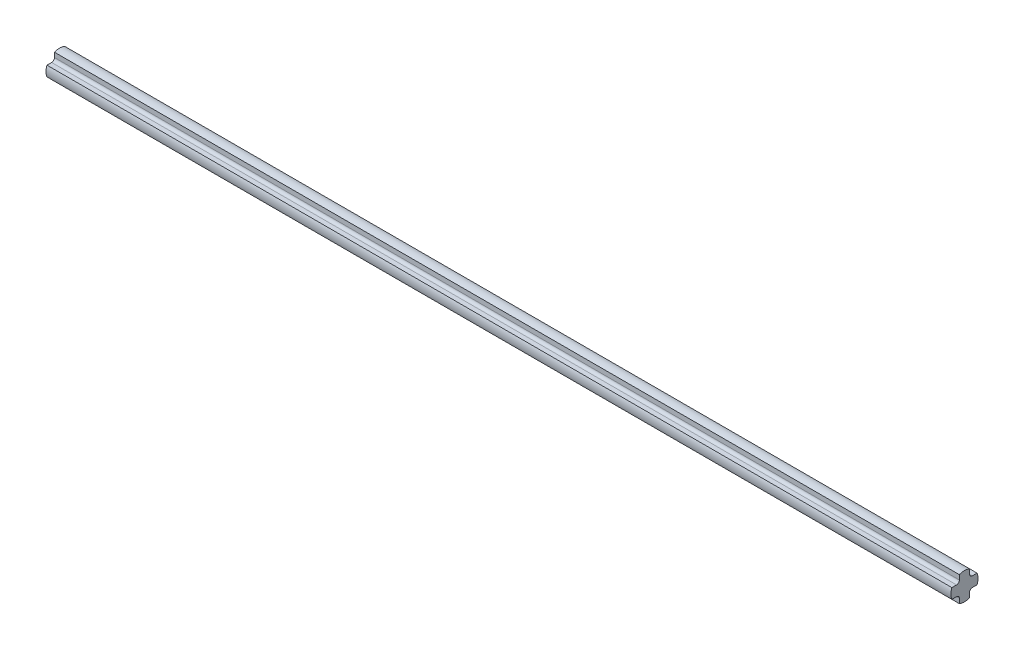
ISO-10303-21;
HEADER;
FILE_DESCRIPTION(('STEP AP214'),'2;1');
FILE_NAME('part.step','',(''),(''),'','','');
FILE_SCHEMA(('AUTOMOTIVE_DESIGN { 1 0 10303 214 1 1 1 1 }'));
ENDSEC;
DATA;
#1=APPLICATION_CONTEXT('core data for automotive mechanical design processes');
#2=APPLICATION_PROTOCOL_DEFINITION('international standard','automotive_design',2000,#1);
#3=PRODUCT_CONTEXT('',#1,'mechanical');
#4=PRODUCT('Part','Part','',(#3));
#5=PRODUCT_RELATED_PRODUCT_CATEGORY('part','',(#4));
#6=PRODUCT_DEFINITION_FORMATION('','',#4);
#7=PRODUCT_DEFINITION_CONTEXT('part definition',#1,'design');
#8=PRODUCT_DEFINITION('design','',#6,#7);
#9=PRODUCT_DEFINITION_SHAPE('','',#8);
#10=(LENGTH_UNIT() NAMED_UNIT(*) SI_UNIT(.MILLI.,.METRE.));
#11=(NAMED_UNIT(*) PLANE_ANGLE_UNIT() SI_UNIT($,.RADIAN.));
#12=(NAMED_UNIT(*) SI_UNIT($,.STERADIAN.) SOLID_ANGLE_UNIT());
#13=UNCERTAINTY_MEASURE_WITH_UNIT(LENGTH_MEASURE(1.E-05),#10,'distance_accuracy_value','');
#14=(GEOMETRIC_REPRESENTATION_CONTEXT(3) GLOBAL_UNCERTAINTY_ASSIGNED_CONTEXT((#13)) GLOBAL_UNIT_ASSIGNED_CONTEXT((#10,
#11,#12)) REPRESENTATION_CONTEXT('',''));
#15=CARTESIAN_POINT('',(0.,0.,0.));
#16=DIRECTION('',(0.,0.,1.));
#17=DIRECTION('',(1.,0.,0.));
#18=AXIS2_PLACEMENT_3D('',#15,#16,#17);
#19=CARTESIAN_POINT('',(72.,5.07010439959474,-6.02572762250566));
#20=DIRECTION('',(-1.,0.,0.));
#21=DIRECTION('',(0.,0.,1.));
#22=AXIS2_PLACEMENT_3D('',#19,#20,#21);
#23=CYLINDRICAL_SURFACE('',#22,2.4);
#24=DIRECTION('',(-1.,0.,0.));
#25=VECTOR('',#24,1.);
#26=CARTESIAN_POINT('',(10.,7.29496394572344,-6.92572762250566));
#27=LINE('',#26,#25);
#28=CARTESIAN_POINT('',(100.,7.29496394572344,-6.92572762250566));
#29=VERTEX_POINT('',#28);
#30=CARTESIAN_POINT('',(-60.,7.29496394572344,-6.92572762250566));
#31=VERTEX_POINT('',#30);
#32=EDGE_CURVE('E62',#29,#31,#27,.T.);
#33=ORIENTED_EDGE('',*,*,#32,.T.);
#34=CARTESIAN_POINT('',(-60.,5.07010439959474,-6.02572762250566));
#35=DIRECTION('',(1.,0.,0.));
#36=DIRECTION('',(0.,0.,-1.));
#37=AXIS2_PLACEMENT_3D('',#34,#35,#36);
#38=CIRCLE('',#37,2.4);
#39=CARTESIAN_POINT('',(-60.,7.29496394572344,-5.12572762250566));
#40=VERTEX_POINT('',#39);
#41=EDGE_CURVE('E162',#31,#40,#38,.T.);
#42=ORIENTED_EDGE('',*,*,#41,.T.);
#43=DIRECTION('',(-1.,0.,0.));
#44=VECTOR('',#43,1.);
#45=CARTESIAN_POINT('',(10.,7.29496394572344,-5.12572762250566));
#46=LINE('',#45,#44);
#47=CARTESIAN_POINT('',(100.,7.29496394572344,-5.12572762250566));
#48=VERTEX_POINT('',#47);
#49=EDGE_CURVE('E158',#48,#40,#46,.T.);
#50=ORIENTED_EDGE('',*,*,#49,.F.);
#51=CARTESIAN_POINT('',(100.,5.07010439959474,-6.02572762250566));
#52=DIRECTION('',(1.,0.,0.));
#53=DIRECTION('',(0.,0.,-1.));
#54=AXIS2_PLACEMENT_3D('',#51,#52,#53);
#55=CIRCLE('',#54,2.4);
#56=EDGE_CURVE('E161',#29,#48,#55,.T.);
#57=ORIENTED_EDGE('',*,*,#56,.F.);
#58=EDGE_LOOP('',(#33,#42,#50,#57));
#59=FACE_BOUND('',#58,.T.);
#60=ADVANCED_FACE('F47',(#59),#23,.T.);
#61=CARTESIAN_POINT('',(72.,6.47010439959474,-5.12572762250566));
#62=DIRECTION('',(0.,0.,-1.));
#63=DIRECTION('',(-1.,0.,0.));
#64=AXIS2_PLACEMENT_3D('',#61,#62,#63);
#65=PLANE('',#64);
#66=ORIENTED_EDGE('',*,*,#49,.T.);
#67=DIRECTION('',(0.,-1.,0.));
#68=VECTOR('',#67,1.);
#69=CARTESIAN_POINT('',(-60.,6.47010439959474,-5.12572762250566));
#70=LINE('',#69,#68);
#71=CARTESIAN_POINT('',(-60.,6.47010439959474,-5.12572762250566));
#72=VERTEX_POINT('',#71);
#73=EDGE_CURVE('E238',#40,#72,#70,.T.);
#74=ORIENTED_EDGE('',*,*,#73,.T.);
#75=DIRECTION('',(-1.,0.,0.));
#76=VECTOR('',#75,1.);
#77=CARTESIAN_POINT('',(72.,6.47010439959474,-5.12572762250566));
#78=LINE('',#77,#76);
#79=CARTESIAN_POINT('',(100.,6.47010439959474,-5.12572762250566));
#80=VERTEX_POINT('',#79);
#81=EDGE_CURVE('E11',#80,#72,#78,.T.);
#82=ORIENTED_EDGE('',*,*,#81,.F.);
#83=DIRECTION('',(0.,-1.,0.));
#84=VECTOR('',#83,1.);
#85=CARTESIAN_POINT('',(100.,6.47010439959474,-5.12572762250566));
#86=LINE('',#85,#84);
#87=EDGE_CURVE('E170',#48,#80,#86,.T.);
#88=ORIENTED_EDGE('',*,*,#87,.F.);
#89=EDGE_LOOP('',(#66,#74,#82,#88));
#90=FACE_BOUND('',#89,.T.);
#91=ADVANCED_FACE('F171',(#90),#65,.F.);
#92=CARTESIAN_POINT('',(72.,6.47010439959474,-4.62572762250566));
#93=DIRECTION('',(-1.,0.,0.));
#94=DIRECTION('',(0.,0.,1.));
#95=AXIS2_PLACEMENT_3D('',#92,#93,#94);
#96=CYLINDRICAL_SURFACE('',#95,0.5);
#97=ORIENTED_EDGE('',*,*,#81,.T.);
#98=CARTESIAN_POINT('',(-60.,6.47010439959474,-4.62572762250566));
#99=DIRECTION('',(-1.,0.,0.));
#100=DIRECTION('',(0.,0.,1.));
#101=AXIS2_PLACEMENT_3D('',#98,#99,#100);
#102=CIRCLE('',#101,0.5);
#103=CARTESIAN_POINT('',(-60.,5.97010439959474,-4.62572762250565));
#104=VERTEX_POINT('',#103);
#105=EDGE_CURVE('E241',#72,#104,#102,.T.);
#106=ORIENTED_EDGE('',*,*,#105,.T.);
#107=DIRECTION('',(-1.,0.,0.));
#108=VECTOR('',#107,1.);
#109=CARTESIAN_POINT('',(72.,5.97010439959474,-4.62572762250565));
#110=LINE('',#109,#108);
#111=CARTESIAN_POINT('',(100.,5.97010439959474,-4.62572762250565));
#112=VERTEX_POINT('',#111);
#113=EDGE_CURVE('E55',#112,#104,#110,.T.);
#114=ORIENTED_EDGE('',*,*,#113,.F.);
#115=CARTESIAN_POINT('',(100.,6.47010439959474,-4.62572762250566));
#116=DIRECTION('',(-1.,0.,0.));
#117=DIRECTION('',(0.,0.,1.));
#118=AXIS2_PLACEMENT_3D('',#115,#116,#117);
#119=CIRCLE('',#118,0.5);
#120=EDGE_CURVE('E176',#80,#112,#119,.T.);
#121=ORIENTED_EDGE('',*,*,#120,.F.);
#122=EDGE_LOOP('',(#97,#106,#114,#121));
#123=FACE_BOUND('',#122,.T.);
#124=ADVANCED_FACE('F341',(#123),#96,.F.);
#125=CARTESIAN_POINT('',(72.,5.97010439959474,-4.62572762250565));
#126=DIRECTION('',(0.,-1.,0.));
#127=DIRECTION('',(0.,0.,-1.));
#128=AXIS2_PLACEMENT_3D('',#125,#126,#127);
#129=PLANE('',#128);
#130=DIRECTION('',(0.,0.,1.));
#131=VECTOR('',#130,1.);
#132=CARTESIAN_POINT('',(100.,5.97010439959474,-4.62572762250565));
#133=LINE('',#132,#131);
#134=CARTESIAN_POINT('',(100.,5.97010439959474,-3.80086807637696));
#135=VERTEX_POINT('',#134);
#136=EDGE_CURVE('E187',#112,#135,#133,.T.);
#137=ORIENTED_EDGE('',*,*,#136,.F.);
#138=ORIENTED_EDGE('',*,*,#113,.T.);
#139=DIRECTION('',(0.,0.,1.));
#140=VECTOR('',#139,1.);
#141=CARTESIAN_POINT('',(-60.,5.97010439959474,-4.62572762250565));
#142=LINE('',#141,#140);
#143=CARTESIAN_POINT('',(-60.,5.97010439959474,-3.80086807637696));
#144=VERTEX_POINT('',#143);
#145=EDGE_CURVE('E245',#104,#144,#142,.T.);
#146=ORIENTED_EDGE('',*,*,#145,.T.);
#147=DIRECTION('',(-1.,0.,0.));
#148=VECTOR('',#147,1.);
#149=CARTESIAN_POINT('',(10.,5.97010439959474,-3.80086807637696));
#150=LINE('',#149,#148);
#151=EDGE_CURVE('E167',#135,#144,#150,.T.);
#152=ORIENTED_EDGE('',*,*,#151,.F.);
#153=EDGE_LOOP('',(#137,#138,#146,#152));
#154=FACE_BOUND('',#153,.T.);
#155=ADVANCED_FACE('F334',(#154),#129,.F.);
#156=CARTESIAN_POINT('',(72.,5.07010439959474,-6.02572762250566));
#157=DIRECTION('',(-1.,0.,0.));
#158=DIRECTION('',(0.,0.,1.));
#159=AXIS2_PLACEMENT_3D('',#156,#157,#158);
#160=CYLINDRICAL_SURFACE('',#159,2.4);
#161=ORIENTED_EDGE('',*,*,#151,.T.);
#162=CARTESIAN_POINT('',(-60.,5.07010439959474,-6.02572762250566));
#163=DIRECTION('',(1.,0.,0.));
#164=DIRECTION('',(0.,0.,-1.));
#165=AXIS2_PLACEMENT_3D('',#162,#163,#164);
#166=CIRCLE('',#165,2.4);
#167=CARTESIAN_POINT('',(-60.,4.17010439959474,-3.80086807637696));
#168=VERTEX_POINT('',#167);
#169=EDGE_CURVE('E249',#144,#168,#166,.T.);
#170=ORIENTED_EDGE('',*,*,#169,.T.);
#171=DIRECTION('',(-1.,0.,0.));
#172=VECTOR('',#171,1.);
#173=CARTESIAN_POINT('',(10.,4.17010439959474,-3.80086807637696));
#174=LINE('',#173,#172);
#175=CARTESIAN_POINT('',(100.,4.17010439959474,-3.80086807637696));
#176=VERTEX_POINT('',#175);
#177=EDGE_CURVE('E309',#176,#168,#174,.T.);
#178=ORIENTED_EDGE('',*,*,#177,.F.);
#179=CARTESIAN_POINT('',(100.,5.07010439959474,-6.02572762250566));
#180=DIRECTION('',(1.,0.,0.));
#181=DIRECTION('',(0.,0.,-1.));
#182=AXIS2_PLACEMENT_3D('',#179,#180,#181);
#183=CIRCLE('',#182,2.4);
#184=EDGE_CURVE('E191',#135,#176,#183,.T.);
#185=ORIENTED_EDGE('',*,*,#184,.F.);
#186=EDGE_LOOP('',(#161,#170,#178,#185));
#187=FACE_BOUND('',#186,.T.);
#188=ADVANCED_FACE('F345',(#187),#160,.T.);
#189=CARTESIAN_POINT('',(72.,4.17010439959474,-4.62572762250565));
#190=DIRECTION('',(0.,1.,0.));
#191=DIRECTION('',(0.,0.,1.));
#192=AXIS2_PLACEMENT_3D('',#189,#190,#191);
#193=PLANE('',#192);
#194=ORIENTED_EDGE('',*,*,#177,.T.);
#195=DIRECTION('',(0.,0.,-1.));
#196=VECTOR('',#195,1.);
#197=CARTESIAN_POINT('',(-60.,4.17010439959474,-4.62572762250565));
#198=LINE('',#197,#196);
#199=CARTESIAN_POINT('',(-60.,4.17010439959474,-4.62572762250565));
#200=VERTEX_POINT('',#199);
#201=EDGE_CURVE('E253',#168,#200,#198,.T.);
#202=ORIENTED_EDGE('',*,*,#201,.T.);
#203=DIRECTION('',(-1.,0.,0.));
#204=VECTOR('',#203,1.);
#205=CARTESIAN_POINT('',(72.,4.17010439959474,-4.62572762250565));
#206=LINE('',#205,#204);
#207=CARTESIAN_POINT('',(100.,4.17010439959474,-4.62572762250565));
#208=VERTEX_POINT('',#207);
#209=EDGE_CURVE('E328',#208,#200,#206,.T.);
#210=ORIENTED_EDGE('',*,*,#209,.F.);
#211=DIRECTION('',(0.,0.,-1.));
#212=VECTOR('',#211,1.);
#213=CARTESIAN_POINT('',(100.,4.17010439959474,-4.62572762250565));
#214=LINE('',#213,#212);
#215=EDGE_CURVE('E195',#176,#208,#214,.T.);
#216=ORIENTED_EDGE('',*,*,#215,.F.);
#217=EDGE_LOOP('',(#194,#202,#210,#216));
#218=FACE_BOUND('',#217,.T.);
#219=ADVANCED_FACE('F347',(#218),#193,.F.);
#220=CARTESIAN_POINT('',(72.,3.67010439959474,-4.62572762250566));
#221=DIRECTION('',(-1.,0.,0.));
#222=DIRECTION('',(0.,0.,1.));
#223=AXIS2_PLACEMENT_3D('',#220,#221,#222);
#224=CYLINDRICAL_SURFACE('',#223,0.5);
#225=ORIENTED_EDGE('',*,*,#209,.T.);
#226=CARTESIAN_POINT('',(-60.,3.67010439959474,-4.62572762250566));
#227=DIRECTION('',(-1.,0.,0.));
#228=DIRECTION('',(0.,0.,1.));
#229=AXIS2_PLACEMENT_3D('',#226,#227,#228);
#230=CIRCLE('',#229,0.5);
#231=CARTESIAN_POINT('',(-60.,3.67010439959474,-5.12572762250566));
#232=VERTEX_POINT('',#231);
#233=EDGE_CURVE('E257',#200,#232,#230,.T.);
#234=ORIENTED_EDGE('',*,*,#233,.T.);
#235=DIRECTION('',(-1.,0.,0.));
#236=VECTOR('',#235,1.);
#237=CARTESIAN_POINT('',(72.,3.67010439959474,-5.12572762250566));
#238=LINE('',#237,#236);
#239=CARTESIAN_POINT('',(100.,3.67010439959474,-5.12572762250566));
#240=VERTEX_POINT('',#239);
#241=EDGE_CURVE('E325',#240,#232,#238,.T.);
#242=ORIENTED_EDGE('',*,*,#241,.F.);
#243=CARTESIAN_POINT('',(100.,3.67010439959474,-4.62572762250566));
#244=DIRECTION('',(-1.,0.,0.));
#245=DIRECTION('',(0.,0.,1.));
#246=AXIS2_PLACEMENT_3D('',#243,#244,#245);
#247=CIRCLE('',#246,0.5);
#248=EDGE_CURVE('E199',#208,#240,#247,.T.);
#249=ORIENTED_EDGE('',*,*,#248,.F.);
#250=EDGE_LOOP('',(#225,#234,#242,#249));
#251=FACE_BOUND('',#250,.T.);
#252=ADVANCED_FACE('F352',(#251),#224,.F.);
#253=CARTESIAN_POINT('',(72.,2.84524485346604,-5.12572762250566));
#254=DIRECTION('',(0.,0.,-1.));
#255=DIRECTION('',(-1.,0.,0.));
#256=AXIS2_PLACEMENT_3D('',#253,#254,#255);
#257=PLANE('',#256);
#258=DIRECTION('',(0.,-1.,0.));
#259=VECTOR('',#258,1.);
#260=CARTESIAN_POINT('',(100.,2.84524485346604,-5.12572762250566));
#261=LINE('',#260,#259);
#262=CARTESIAN_POINT('',(100.,2.84524485346604,-5.12572762250566));
#263=VERTEX_POINT('',#262);
#264=EDGE_CURVE('E203',#240,#263,#261,.T.);
#265=ORIENTED_EDGE('',*,*,#264,.F.);
#266=ORIENTED_EDGE('',*,*,#241,.T.);
#267=DIRECTION('',(0.,-1.,0.));
#268=VECTOR('',#267,1.);
#269=CARTESIAN_POINT('',(-60.,2.84524485346604,-5.12572762250566));
#270=LINE('',#269,#268);
#271=CARTESIAN_POINT('',(-60.,2.84524485346604,-5.12572762250566));
#272=VERTEX_POINT('',#271);
#273=EDGE_CURVE('E261',#232,#272,#270,.T.);
#274=ORIENTED_EDGE('',*,*,#273,.T.);
#275=DIRECTION('',(-1.,0.,0.));
#276=VECTOR('',#275,1.);
#277=CARTESIAN_POINT('',(10.,2.84524485346604,-5.12572762250566));
#278=LINE('',#277,#276);
#279=EDGE_CURVE('E306',#263,#272,#278,.T.);
#280=ORIENTED_EDGE('',*,*,#279,.F.);
#281=EDGE_LOOP('',(#265,#266,#274,#280));
#282=FACE_BOUND('',#281,.T.);
#283=ADVANCED_FACE('F357',(#282),#257,.F.);
#284=CARTESIAN_POINT('',(72.,5.07010439959474,-6.02572762250566));
#285=DIRECTION('',(-1.,0.,0.));
#286=DIRECTION('',(0.,0.,1.));
#287=AXIS2_PLACEMENT_3D('',#284,#285,#286);
#288=CYLINDRICAL_SURFACE('',#287,2.4);
#289=DIRECTION('',(-1.,0.,0.));
#290=VECTOR('',#289,1.);
#291=CARTESIAN_POINT('',(10.,2.84524485346604,-6.92572762250566));
#292=LINE('',#291,#290);
#293=CARTESIAN_POINT('',(100.,2.84524485346604,-6.92572762250566));
#294=VERTEX_POINT('',#293);
#295=CARTESIAN_POINT('',(-60.,2.84524485346604,-6.92572762250566));
#296=VERTEX_POINT('',#295);
#297=EDGE_CURVE('E303',#294,#296,#292,.T.);
#298=ORIENTED_EDGE('',*,*,#297,.F.);
#299=CARTESIAN_POINT('',(100.,5.07010439959474,-6.02572762250566));
#300=DIRECTION('',(1.,0.,0.));
#301=DIRECTION('',(0.,0.,-1.));
#302=AXIS2_PLACEMENT_3D('',#299,#300,#301);
#303=CIRCLE('',#302,2.4);
#304=EDGE_CURVE('E207',#263,#294,#303,.T.);
#305=ORIENTED_EDGE('',*,*,#304,.F.);
#306=ORIENTED_EDGE('',*,*,#279,.T.);
#307=CARTESIAN_POINT('',(-60.,5.07010439959474,-6.02572762250566));
#308=DIRECTION('',(1.,0.,0.));
#309=DIRECTION('',(0.,0.,-1.));
#310=AXIS2_PLACEMENT_3D('',#307,#308,#309);
#311=CIRCLE('',#310,2.4);
#312=EDGE_CURVE('E265',#272,#296,#311,.T.);
#313=ORIENTED_EDGE('',*,*,#312,.T.);
#314=EDGE_LOOP('',(#298,#305,#306,#313));
#315=FACE_BOUND('',#314,.T.);
#316=ADVANCED_FACE('F359',(#315),#288,.T.);
#317=CARTESIAN_POINT('',(72.,2.84524485346604,-6.92572762250566));
#318=DIRECTION('',(0.,0.,1.));
#319=DIRECTION('',(0.,-1.,0.));
#320=AXIS2_PLACEMENT_3D('',#317,#318,#319);
#321=PLANE('',#320);
#322=ORIENTED_EDGE('',*,*,#297,.T.);
#323=DIRECTION('',(0.,1.,0.));
#324=VECTOR('',#323,1.);
#325=CARTESIAN_POINT('',(-60.,2.84524485346604,-6.92572762250566));
#326=LINE('',#325,#324);
#327=CARTESIAN_POINT('',(-60.,3.67010439959474,-6.92572762250566));
#328=VERTEX_POINT('',#327);
#329=EDGE_CURVE('E269',#296,#328,#326,.T.);
#330=ORIENTED_EDGE('',*,*,#329,.T.);
#331=DIRECTION('',(-1.,0.,0.));
#332=VECTOR('',#331,1.);
#333=CARTESIAN_POINT('',(72.,3.67010439959474,-6.92572762250566));
#334=LINE('',#333,#332);
#335=CARTESIAN_POINT('',(100.,3.67010439959474,-6.92572762250566));
#336=VERTEX_POINT('',#335);
#337=EDGE_CURVE('E322',#336,#328,#334,.T.);
#338=ORIENTED_EDGE('',*,*,#337,.F.);
#339=DIRECTION('',(0.,1.,0.));
#340=VECTOR('',#339,1.);
#341=CARTESIAN_POINT('',(100.,2.84524485346604,-6.92572762250566));
#342=LINE('',#341,#340);
#343=EDGE_CURVE('E211',#294,#336,#342,.T.);
#344=ORIENTED_EDGE('',*,*,#343,.F.);
#345=EDGE_LOOP('',(#322,#330,#338,#344));
#346=FACE_BOUND('',#345,.T.);
#347=ADVANCED_FACE('F364',(#346),#321,.F.);
#348=CARTESIAN_POINT('',(72.,3.67010439959474,-7.42572762250566));
#349=DIRECTION('',(-1.,0.,0.));
#350=DIRECTION('',(0.,0.,1.));
#351=AXIS2_PLACEMENT_3D('',#348,#349,#350);
#352=CYLINDRICAL_SURFACE('',#351,0.5);
#353=ORIENTED_EDGE('',*,*,#337,.T.);
#354=CARTESIAN_POINT('',(-60.,3.67010439959474,-7.42572762250566));
#355=DIRECTION('',(-1.,0.,0.));
#356=DIRECTION('',(0.,0.,1.));
#357=AXIS2_PLACEMENT_3D('',#354,#355,#356);
#358=CIRCLE('',#357,0.5);
#359=CARTESIAN_POINT('',(-60.,4.17010439959474,-7.42572762250566));
#360=VERTEX_POINT('',#359);
#361=EDGE_CURVE('E273',#328,#360,#358,.T.);
#362=ORIENTED_EDGE('',*,*,#361,.T.);
#363=DIRECTION('',(-1.,0.,0.));
#364=VECTOR('',#363,1.);
#365=CARTESIAN_POINT('',(72.,4.17010439959474,-7.42572762250566));
#366=LINE('',#365,#364);
#367=CARTESIAN_POINT('',(100.,4.17010439959474,-7.42572762250566));
#368=VERTEX_POINT('',#367);
#369=EDGE_CURVE('E319',#368,#360,#366,.T.);
#370=ORIENTED_EDGE('',*,*,#369,.F.);
#371=CARTESIAN_POINT('',(100.,3.67010439959474,-7.42572762250566));
#372=DIRECTION('',(-1.,0.,0.));
#373=DIRECTION('',(0.,0.,1.));
#374=AXIS2_PLACEMENT_3D('',#371,#372,#373);
#375=CIRCLE('',#374,0.5);
#376=EDGE_CURVE('E215',#336,#368,#375,.T.);
#377=ORIENTED_EDGE('',*,*,#376,.F.);
#378=EDGE_LOOP('',(#353,#362,#370,#377));
#379=FACE_BOUND('',#378,.T.);
#380=ADVANCED_FACE('F369',(#379),#352,.F.);
#381=CARTESIAN_POINT('',(72.,4.17010439959474,-8.25058716863435));
#382=DIRECTION('',(0.,1.,0.));
#383=DIRECTION('',(0.,0.,1.));
#384=AXIS2_PLACEMENT_3D('',#381,#382,#383);
#385=PLANE('',#384);
#386=DIRECTION('',(0.,0.,-1.));
#387=VECTOR('',#386,1.);
#388=CARTESIAN_POINT('',(100.,4.17010439959474,-8.25058716863435));
#389=LINE('',#388,#387);
#390=CARTESIAN_POINT('',(100.,4.17010439959474,-8.25058716863435));
#391=VERTEX_POINT('',#390);
#392=EDGE_CURVE('E219',#368,#391,#389,.T.);
#393=ORIENTED_EDGE('',*,*,#392,.F.);
#394=ORIENTED_EDGE('',*,*,#369,.T.);
#395=DIRECTION('',(0.,0.,-1.));
#396=VECTOR('',#395,1.);
#397=CARTESIAN_POINT('',(-60.,4.17010439959474,-8.25058716863435));
#398=LINE('',#397,#396);
#399=CARTESIAN_POINT('',(-60.,4.17010439959474,-8.25058716863435));
#400=VERTEX_POINT('',#399);
#401=EDGE_CURVE('E277',#360,#400,#398,.T.);
#402=ORIENTED_EDGE('',*,*,#401,.T.);
#403=DIRECTION('',(-1.,0.,0.));
#404=VECTOR('',#403,1.);
#405=CARTESIAN_POINT('',(10.,4.17010439959474,-8.25058716863435));
#406=LINE('',#405,#404);
#407=EDGE_CURVE('E300',#391,#400,#406,.T.);
#408=ORIENTED_EDGE('',*,*,#407,.F.);
#409=EDGE_LOOP('',(#393,#394,#402,#408));
#410=FACE_BOUND('',#409,.T.);
#411=ADVANCED_FACE('F371',(#410),#385,.F.);
#412=CARTESIAN_POINT('',(72.,5.07010439959474,-6.02572762250566));
#413=DIRECTION('',(-1.,0.,0.));
#414=DIRECTION('',(0.,0.,1.));
#415=AXIS2_PLACEMENT_3D('',#412,#413,#414);
#416=CYLINDRICAL_SURFACE('',#415,2.4);
#417=ORIENTED_EDGE('',*,*,#407,.T.);
#418=CARTESIAN_POINT('',(-60.,5.07010439959474,-6.02572762250566));
#419=DIRECTION('',(1.,0.,0.));
#420=DIRECTION('',(0.,0.,-1.));
#421=AXIS2_PLACEMENT_3D('',#418,#419,#420);
#422=CIRCLE('',#421,2.4);
#423=CARTESIAN_POINT('',(-60.,5.97010439959474,-8.25058716863436));
#424=VERTEX_POINT('',#423);
#425=EDGE_CURVE('E281',#400,#424,#422,.T.);
#426=ORIENTED_EDGE('',*,*,#425,.T.);
#427=DIRECTION('',(-1.,0.,0.));
#428=VECTOR('',#427,1.);
#429=CARTESIAN_POINT('',(10.,5.97010439959474,-8.25058716863436));
#430=LINE('',#429,#428);
#431=CARTESIAN_POINT('',(100.,5.97010439959474,-8.25058716863436));
#432=VERTEX_POINT('',#431);
#433=EDGE_CURVE('E297',#432,#424,#430,.T.);
#434=ORIENTED_EDGE('',*,*,#433,.F.);
#435=CARTESIAN_POINT('',(100.,5.07010439959474,-6.02572762250566));
#436=DIRECTION('',(1.,0.,0.));
#437=DIRECTION('',(0.,0.,-1.));
#438=AXIS2_PLACEMENT_3D('',#435,#436,#437);
#439=CIRCLE('',#438,2.4);
#440=EDGE_CURVE('E223',#391,#432,#439,.T.);
#441=ORIENTED_EDGE('',*,*,#440,.F.);
#442=EDGE_LOOP('',(#417,#426,#434,#441));
#443=FACE_BOUND('',#442,.T.);
#444=ADVANCED_FACE('F376',(#443),#416,.T.);
#445=CARTESIAN_POINT('',(72.,5.97010439959474,-8.25058716863436));
#446=DIRECTION('',(0.,-1.,0.));
#447=DIRECTION('',(0.,0.,-1.));
#448=AXIS2_PLACEMENT_3D('',#445,#446,#447);
#449=PLANE('',#448);
#450=ORIENTED_EDGE('',*,*,#433,.T.);
#451=DIRECTION('',(0.,0.,1.));
#452=VECTOR('',#451,1.);
#453=CARTESIAN_POINT('',(-60.,5.97010439959474,-8.25058716863436));
#454=LINE('',#453,#452);
#455=CARTESIAN_POINT('',(-60.,5.97010439959474,-7.42572762250566));
#456=VERTEX_POINT('',#455);
#457=EDGE_CURVE('E285',#424,#456,#454,.T.);
#458=ORIENTED_EDGE('',*,*,#457,.T.);
#459=DIRECTION('',(-1.,0.,0.));
#460=VECTOR('',#459,1.);
#461=CARTESIAN_POINT('',(72.,5.97010439959474,-7.42572762250566));
#462=LINE('',#461,#460);
#463=CARTESIAN_POINT('',(100.,5.97010439959474,-7.42572762250566));
#464=VERTEX_POINT('',#463);
#465=EDGE_CURVE('E316',#464,#456,#462,.T.);
#466=ORIENTED_EDGE('',*,*,#465,.F.);
#467=DIRECTION('',(0.,0.,1.));
#468=VECTOR('',#467,1.);
#469=CARTESIAN_POINT('',(100.,5.97010439959474,-8.25058716863436));
#470=LINE('',#469,#468);
#471=EDGE_CURVE('E227',#432,#464,#470,.T.);
#472=ORIENTED_EDGE('',*,*,#471,.F.);
#473=EDGE_LOOP('',(#450,#458,#466,#472));
#474=FACE_BOUND('',#473,.T.);
#475=ADVANCED_FACE('F381',(#474),#449,.F.);
#476=CARTESIAN_POINT('',(72.,6.47010439959474,-7.42572762250566));
#477=DIRECTION('',(-1.,0.,0.));
#478=DIRECTION('',(0.,0.,1.));
#479=AXIS2_PLACEMENT_3D('',#476,#477,#478);
#480=CYLINDRICAL_SURFACE('',#479,0.5);
#481=ORIENTED_EDGE('',*,*,#465,.T.);
#482=CARTESIAN_POINT('',(-60.,6.47010439959474,-7.42572762250566));
#483=DIRECTION('',(-1.,0.,0.));
#484=DIRECTION('',(0.,0.,1.));
#485=AXIS2_PLACEMENT_3D('',#482,#483,#484);
#486=CIRCLE('',#485,0.5);
#487=CARTESIAN_POINT('',(-60.,6.47010439959474,-6.92572762250566));
#488=VERTEX_POINT('',#487);
#489=EDGE_CURVE('E289',#456,#488,#486,.T.);
#490=ORIENTED_EDGE('',*,*,#489,.T.);
#491=DIRECTION('',(-1.,0.,0.));
#492=VECTOR('',#491,1.);
#493=CARTESIAN_POINT('',(72.,6.47010439959474,-6.92572762250566));
#494=LINE('',#493,#492);
#495=CARTESIAN_POINT('',(100.,6.47010439959474,-6.92572762250566));
#496=VERTEX_POINT('',#495);
#497=EDGE_CURVE('E70',#496,#488,#494,.T.);
#498=ORIENTED_EDGE('',*,*,#497,.F.);
#499=CARTESIAN_POINT('',(100.,6.47010439959474,-7.42572762250566));
#500=DIRECTION('',(-1.,0.,0.));
#501=DIRECTION('',(0.,0.,1.));
#502=AXIS2_PLACEMENT_3D('',#499,#500,#501);
#503=CIRCLE('',#502,0.5);
#504=EDGE_CURVE('E231',#464,#496,#503,.T.);
#505=ORIENTED_EDGE('',*,*,#504,.F.);
#506=EDGE_LOOP('',(#481,#490,#498,#505));
#507=FACE_BOUND('',#506,.T.);
#508=ADVANCED_FACE('F383',(#507),#480,.F.);
#509=CARTESIAN_POINT('',(72.,6.47010439959474,-6.92572762250566));
#510=DIRECTION('',(0.,0.,1.));
#511=DIRECTION('',(1.,0.,0.));
#512=AXIS2_PLACEMENT_3D('',#509,#510,#511);
#513=PLANE('',#512);
#514=DIRECTION('',(0.,1.,0.));
#515=VECTOR('',#514,1.);
#516=CARTESIAN_POINT('',(100.,6.47010439959474,-6.92572762250566));
#517=LINE('',#516,#515);
#518=EDGE_CURVE('E181',#496,#29,#517,.T.);
#519=ORIENTED_EDGE('',*,*,#518,.F.);
#520=ORIENTED_EDGE('',*,*,#497,.T.);
#521=DIRECTION('',(0.,1.,0.));
#522=VECTOR('',#521,1.);
#523=CARTESIAN_POINT('',(-60.,6.47010439959474,-6.92572762250566));
#524=LINE('',#523,#522);
#525=EDGE_CURVE('E292',#488,#31,#524,.T.);
#526=ORIENTED_EDGE('',*,*,#525,.T.);
#527=ORIENTED_EDGE('',*,*,#32,.F.);
#528=EDGE_LOOP('',(#519,#520,#526,#527));
#529=FACE_BOUND('',#528,.T.);
#530=ADVANCED_FACE('F385',(#529),#513,.F.);
#531=CARTESIAN_POINT('',(-60.,5.07010439959474,-6.02572762250566));
#532=DIRECTION('',(1.,0.,0.));
#533=DIRECTION('',(0.,0.,-1.));
#534=AXIS2_PLACEMENT_3D('',#531,#532,#533);
#535=PLANE('',#534);
#536=ORIENTED_EDGE('',*,*,#41,.F.);
#537=ORIENTED_EDGE('',*,*,#525,.F.);
#538=ORIENTED_EDGE('',*,*,#489,.F.);
#539=ORIENTED_EDGE('',*,*,#457,.F.);
#540=ORIENTED_EDGE('',*,*,#425,.F.);
#541=ORIENTED_EDGE('',*,*,#401,.F.);
#542=ORIENTED_EDGE('',*,*,#361,.F.);
#543=ORIENTED_EDGE('',*,*,#329,.F.);
#544=ORIENTED_EDGE('',*,*,#312,.F.);
#545=ORIENTED_EDGE('',*,*,#273,.F.);
#546=ORIENTED_EDGE('',*,*,#233,.F.);
#547=ORIENTED_EDGE('',*,*,#201,.F.);
#548=ORIENTED_EDGE('',*,*,#169,.F.);
#549=ORIENTED_EDGE('',*,*,#145,.F.);
#550=ORIENTED_EDGE('',*,*,#105,.F.);
#551=ORIENTED_EDGE('',*,*,#73,.F.);
#552=EDGE_LOOP('',(#536,#537,#538,#539,#540,#541,#542,#543,#544,#545,#546,#547,#548,#549,#550,#551));
#553=FACE_BOUND('',#552,.T.);
#554=ADVANCED_FACE('F339',(#553),#535,.F.);
#555=CARTESIAN_POINT('',(100.,5.07010439959474,-6.02572762250566));
#556=DIRECTION('',(1.,0.,0.));
#557=DIRECTION('',(0.,0.,-1.));
#558=AXIS2_PLACEMENT_3D('',#555,#556,#557);
#559=PLANE('',#558);
#560=ORIENTED_EDGE('',*,*,#56,.T.);
#561=ORIENTED_EDGE('',*,*,#87,.T.);
#562=ORIENTED_EDGE('',*,*,#120,.T.);
#563=ORIENTED_EDGE('',*,*,#136,.T.);
#564=ORIENTED_EDGE('',*,*,#184,.T.);
#565=ORIENTED_EDGE('',*,*,#215,.T.);
#566=ORIENTED_EDGE('',*,*,#248,.T.);
#567=ORIENTED_EDGE('',*,*,#264,.T.);
#568=ORIENTED_EDGE('',*,*,#304,.T.);
#569=ORIENTED_EDGE('',*,*,#343,.T.);
#570=ORIENTED_EDGE('',*,*,#376,.T.);
#571=ORIENTED_EDGE('',*,*,#392,.T.);
#572=ORIENTED_EDGE('',*,*,#440,.T.);
#573=ORIENTED_EDGE('',*,*,#471,.T.);
#574=ORIENTED_EDGE('',*,*,#504,.T.);
#575=ORIENTED_EDGE('',*,*,#518,.T.);
#576=EDGE_LOOP('',(#560,#561,#562,#563,#564,#565,#566,#567,#568,#569,#570,#571,#572,#573,#574,#575));
#577=FACE_BOUND('',#576,.T.);
#578=ADVANCED_FACE('F179',(#577),#559,.T.);
#579=CLOSED_SHELL('',(#60,#91,#124,#155,#188,#219,#252,#283,#316,#347,#380,#411,#444,#475,#508,
#530,#554,#578));
#580=MANIFOLD_SOLID_BREP('B2',#579);
#581=ADVANCED_BREP_SHAPE_REPRESENTATION('',(#18,#580),#14);
#582=SHAPE_DEFINITION_REPRESENTATION(#9,#581);
ENDSEC;
END-ISO-10303-21;
